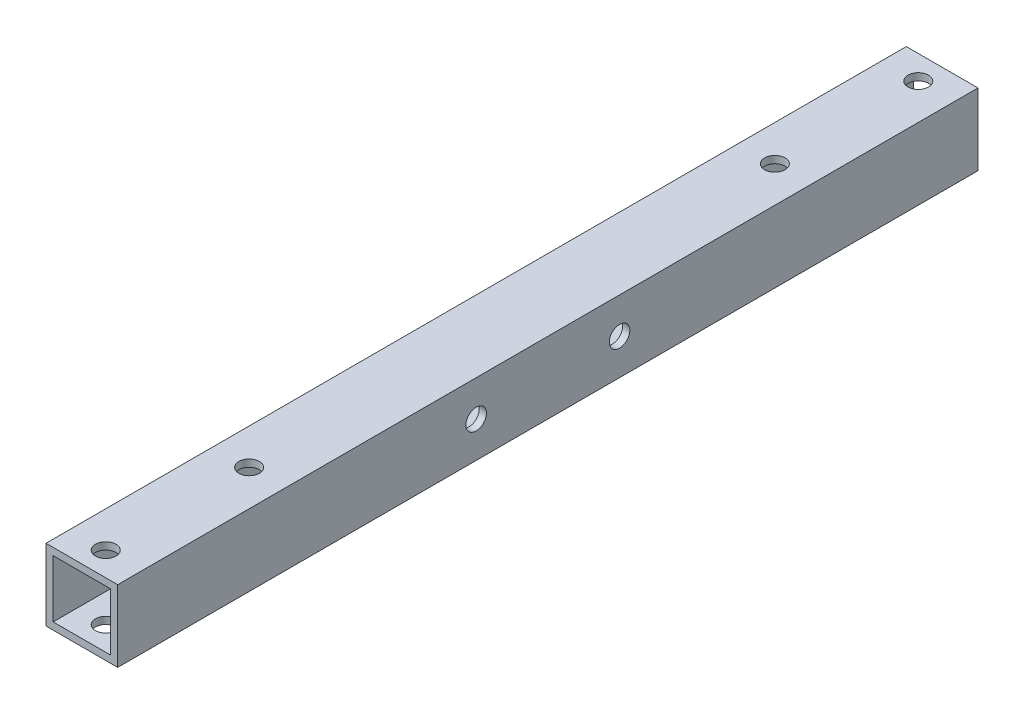
ISO-10303-21;
HEADER;
FILE_DESCRIPTION(('STEP AP214'),'2;1');
FILE_NAME('part.step','',(''),(''),'','','');
FILE_SCHEMA(('AUTOMOTIVE_DESIGN { 1 0 10303 214 1 1 1 1 }'));
ENDSEC;
DATA;
#1=APPLICATION_CONTEXT('core data for automotive mechanical design processes');
#2=APPLICATION_PROTOCOL_DEFINITION('international standard','automotive_design',2000,#1);
#3=PRODUCT_CONTEXT('',#1,'mechanical');
#4=PRODUCT('Part','Part','',(#3));
#5=PRODUCT_RELATED_PRODUCT_CATEGORY('part','',(#4));
#6=PRODUCT_DEFINITION_FORMATION('','',#4);
#7=PRODUCT_DEFINITION_CONTEXT('part definition',#1,'design');
#8=PRODUCT_DEFINITION('design','',#6,#7);
#9=PRODUCT_DEFINITION_SHAPE('','',#8);
#10=(LENGTH_UNIT() NAMED_UNIT(*) SI_UNIT(.MILLI.,.METRE.));
#11=(NAMED_UNIT(*) PLANE_ANGLE_UNIT() SI_UNIT($,.RADIAN.));
#12=(NAMED_UNIT(*) SI_UNIT($,.STERADIAN.) SOLID_ANGLE_UNIT());
#13=UNCERTAINTY_MEASURE_WITH_UNIT(LENGTH_MEASURE(1.E-05),#10,'distance_accuracy_value','');
#14=(GEOMETRIC_REPRESENTATION_CONTEXT(3) GLOBAL_UNCERTAINTY_ASSIGNED_CONTEXT((#13)) GLOBAL_UNIT_ASSIGNED_CONTEXT((#10,
#11,#12)) REPRESENTATION_CONTEXT('',''));
#15=CARTESIAN_POINT('',(0.,0.,0.));
#16=DIRECTION('',(0.,0.,1.));
#17=DIRECTION('',(1.,0.,0.));
#18=AXIS2_PLACEMENT_3D('',#15,#16,#17);
#19=CARTESIAN_POINT('',(-7.5,7.5,180.));
#20=DIRECTION('',(0.,-1.,0.));
#21=DIRECTION('',(0.,0.,-1.));
#22=AXIS2_PLACEMENT_3D('',#19,#20,#21);
#23=PLANE('',#22);
#24=CARTESIAN_POINT('',(0.,7.5,5.));
#25=DIRECTION('',(0.,1.,0.));
#26=DIRECTION('',(0.,0.,1.));
#27=AXIS2_PLACEMENT_3D('',#24,#25,#26);
#28=CIRCLE('',#27,2.15);
#29=CARTESIAN_POINT('',(0.,7.5,7.15));
#30=VERTEX_POINT('',#29);
#31=EDGE_CURVE('E295',#30,#30,#28,.T.);
#32=ORIENTED_EDGE('',*,*,#31,.F.);
#33=EDGE_LOOP('',(#32));
#34=FACE_BOUND('',#33,.T.);
#35=CARTESIAN_POINT('',(0.,7.5,35.));
#36=DIRECTION('',(0.,1.,0.));
#37=DIRECTION('',(0.,0.,1.));
#38=AXIS2_PLACEMENT_3D('',#35,#36,#37);
#39=CIRCLE('',#38,2.15);
#40=CARTESIAN_POINT('',(0.,7.5,37.15));
#41=VERTEX_POINT('',#40);
#42=EDGE_CURVE('E298',#41,#41,#39,.T.);
#43=ORIENTED_EDGE('',*,*,#42,.F.);
#44=EDGE_LOOP('',(#43));
#45=FACE_BOUND('',#44,.T.);
#46=DIRECTION('',(-1.,0.,0.));
#47=VECTOR('',#46,1.);
#48=CARTESIAN_POINT('',(-7.5,7.5,0.));
#49=LINE('',#48,#47);
#50=CARTESIAN_POINT('',(7.5,7.5,0.));
#51=VERTEX_POINT('',#50);
#52=CARTESIAN_POINT('',(-7.5,7.5,0.));
#53=VERTEX_POINT('',#52);
#54=EDGE_CURVE('E178',#51,#53,#49,.T.);
#55=ORIENTED_EDGE('',*,*,#54,.T.);
#56=DIRECTION('',(0.,0.,-1.));
#57=VECTOR('',#56,1.);
#58=CARTESIAN_POINT('',(-7.5,7.5,180.));
#59=LINE('',#58,#57);
#60=CARTESIAN_POINT('',(-7.5,7.5,180.));
#61=VERTEX_POINT('',#60);
#62=EDGE_CURVE('E67',#61,#53,#59,.T.);
#63=ORIENTED_EDGE('',*,*,#62,.F.);
#64=DIRECTION('',(-1.,0.,0.));
#65=VECTOR('',#64,1.);
#66=CARTESIAN_POINT('',(-7.5,7.5,180.));
#67=LINE('',#66,#65);
#68=CARTESIAN_POINT('',(7.5,7.5,180.));
#69=VERTEX_POINT('',#68);
#70=EDGE_CURVE('E168',#69,#61,#67,.T.);
#71=ORIENTED_EDGE('',*,*,#70,.F.);
#72=DIRECTION('',(0.,0.,-1.));
#73=VECTOR('',#72,1.);
#74=CARTESIAN_POINT('',(7.5,7.5,180.));
#75=LINE('',#74,#73);
#76=EDGE_CURVE('E12',#69,#51,#75,.T.);
#77=ORIENTED_EDGE('',*,*,#76,.T.);
#78=EDGE_LOOP('',(#55,#63,#71,#77));
#79=FACE_BOUND('',#78,.T.);
#80=CARTESIAN_POINT('',(0.,7.5,175.));
#81=DIRECTION('',(0.,1.,0.));
#82=DIRECTION('',(0.,0.,1.));
#83=AXIS2_PLACEMENT_3D('',#80,#81,#82);
#84=CIRCLE('',#83,2.15000000000001);
#85=CARTESIAN_POINT('',(0.,7.5,177.15));
#86=VERTEX_POINT('',#85);
#87=EDGE_CURVE('E306',#86,#86,#84,.F.);
#88=ORIENTED_EDGE('',*,*,#87,.T.);
#89=EDGE_LOOP('',(#88));
#90=FACE_BOUND('',#89,.T.);
#91=CARTESIAN_POINT('',(0.,7.5,145.));
#92=DIRECTION('',(0.,1.,0.));
#93=DIRECTION('',(0.,0.,1.));
#94=AXIS2_PLACEMENT_3D('',#91,#92,#93);
#95=CIRCLE('',#94,2.14999999999998);
#96=CARTESIAN_POINT('',(0.,7.5,147.15));
#97=VERTEX_POINT('',#96);
#98=EDGE_CURVE('E313',#97,#97,#95,.F.);
#99=ORIENTED_EDGE('',*,*,#98,.T.);
#100=EDGE_LOOP('',(#99));
#101=FACE_BOUND('',#100,.T.);
#102=ADVANCED_FACE('F58',(#34,#45,#79,#90,#101),#23,.F.);
#103=CARTESIAN_POINT('',(-7.5,-7.5,180.));
#104=DIRECTION('',(0.,1.,0.));
#105=DIRECTION('',(0.,0.,1.));
#106=AXIS2_PLACEMENT_3D('',#103,#104,#105);
#107=PLANE('',#106);
#108=CARTESIAN_POINT('',(0.,-7.5,5.));
#109=DIRECTION('',(0.,1.,0.));
#110=DIRECTION('',(0.,0.,1.));
#111=AXIS2_PLACEMENT_3D('',#108,#109,#110);
#112=CIRCLE('',#111,2.15);
#113=CARTESIAN_POINT('',(0.,-7.5,7.15));
#114=VERTEX_POINT('',#113);
#115=EDGE_CURVE('E202',#114,#114,#112,.T.);
#116=ORIENTED_EDGE('',*,*,#115,.T.);
#117=EDGE_LOOP('',(#116));
#118=FACE_BOUND('',#117,.T.);
#119=CARTESIAN_POINT('',(0.,-7.5,35.));
#120=DIRECTION('',(0.,1.,0.));
#121=DIRECTION('',(0.,0.,1.));
#122=AXIS2_PLACEMENT_3D('',#119,#120,#121);
#123=CIRCLE('',#122,2.15);
#124=CARTESIAN_POINT('',(0.,-7.5,37.15));
#125=VERTEX_POINT('',#124);
#126=EDGE_CURVE('E300',#125,#125,#123,.T.);
#127=ORIENTED_EDGE('',*,*,#126,.T.);
#128=EDGE_LOOP('',(#127));
#129=FACE_BOUND('',#128,.T.);
#130=DIRECTION('',(1.,0.,0.));
#131=VECTOR('',#130,1.);
#132=CARTESIAN_POINT('',(-7.5,-7.5,0.));
#133=LINE('',#132,#131);
#134=CARTESIAN_POINT('',(-7.5,-7.5,0.));
#135=VERTEX_POINT('',#134);
#136=CARTESIAN_POINT('',(7.5,-7.5,0.));
#137=VERTEX_POINT('',#136);
#138=EDGE_CURVE('E169',#135,#137,#133,.T.);
#139=ORIENTED_EDGE('',*,*,#138,.T.);
#140=DIRECTION('',(0.,0.,-1.));
#141=VECTOR('',#140,1.);
#142=CARTESIAN_POINT('',(7.5,-7.5,180.));
#143=LINE('',#142,#141);
#144=CARTESIAN_POINT('',(7.5,-7.5,180.));
#145=VERTEX_POINT('',#144);
#146=EDGE_CURVE('E175',#145,#137,#143,.T.);
#147=ORIENTED_EDGE('',*,*,#146,.F.);
#148=DIRECTION('',(1.,0.,0.));
#149=VECTOR('',#148,1.);
#150=CARTESIAN_POINT('',(-7.5,-7.5,180.));
#151=LINE('',#150,#149);
#152=CARTESIAN_POINT('',(-7.5,-7.5,180.));
#153=VERTEX_POINT('',#152);
#154=EDGE_CURVE('E173',#153,#145,#151,.T.);
#155=ORIENTED_EDGE('',*,*,#154,.F.);
#156=DIRECTION('',(0.,0.,-1.));
#157=VECTOR('',#156,1.);
#158=CARTESIAN_POINT('',(-7.5,-7.5,180.));
#159=LINE('',#158,#157);
#160=EDGE_CURVE('E185',#153,#135,#159,.T.);
#161=ORIENTED_EDGE('',*,*,#160,.T.);
#162=EDGE_LOOP('',(#139,#147,#155,#161));
#163=FACE_BOUND('',#162,.T.);
#164=CARTESIAN_POINT('',(0.,-7.5,175.));
#165=DIRECTION('',(0.,1.,0.));
#166=DIRECTION('',(0.,0.,1.));
#167=AXIS2_PLACEMENT_3D('',#164,#165,#166);
#168=CIRCLE('',#167,2.15000000000001);
#169=CARTESIAN_POINT('',(0.,-7.5,177.15));
#170=VERTEX_POINT('',#169);
#171=EDGE_CURVE('E301',#170,#170,#168,.F.);
#172=ORIENTED_EDGE('',*,*,#171,.F.);
#173=EDGE_LOOP('',(#172));
#174=FACE_BOUND('',#173,.T.);
#175=CARTESIAN_POINT('',(0.,-7.5,145.));
#176=DIRECTION('',(0.,1.,0.));
#177=DIRECTION('',(0.,0.,1.));
#178=AXIS2_PLACEMENT_3D('',#175,#176,#177);
#179=CIRCLE('',#178,2.14999999999998);
#180=CARTESIAN_POINT('',(0.,-7.5,147.15));
#181=VERTEX_POINT('',#180);
#182=EDGE_CURVE('E310',#181,#181,#179,.F.);
#183=ORIENTED_EDGE('',*,*,#182,.F.);
#184=EDGE_LOOP('',(#183));
#185=FACE_BOUND('',#184,.T.);
#186=ADVANCED_FACE('F276',(#118,#129,#163,#174,#185),#107,.F.);
#187=CARTESIAN_POINT('',(-7.5,6.,180.));
#188=DIRECTION('',(0.,-1.,0.));
#189=DIRECTION('',(0.,0.,-1.));
#190=AXIS2_PLACEMENT_3D('',#187,#188,#189);
#191=PLANE('',#190);
#192=CARTESIAN_POINT('',(0.,6.,5.));
#193=DIRECTION('',(0.,-1.,0.));
#194=DIRECTION('',(0.,0.,-1.));
#195=AXIS2_PLACEMENT_3D('',#192,#193,#194);
#196=CIRCLE('',#195,2.15);
#197=CARTESIAN_POINT('',(0.,6.,2.85));
#198=VERTEX_POINT('',#197);
#199=EDGE_CURVE('E220',#198,#198,#196,.T.);
#200=ORIENTED_EDGE('',*,*,#199,.F.);
#201=EDGE_LOOP('',(#200));
#202=FACE_BOUND('',#201,.T.);
#203=CARTESIAN_POINT('',(0.,6.,175.));
#204=DIRECTION('',(0.,-1.,0.));
#205=DIRECTION('',(0.,0.,-1.));
#206=AXIS2_PLACEMENT_3D('',#203,#204,#205);
#207=CIRCLE('',#206,2.15000000000001);
#208=CARTESIAN_POINT('',(0.,6.,172.85));
#209=VERTEX_POINT('',#208);
#210=EDGE_CURVE('E205',#209,#209,#207,.F.);
#211=ORIENTED_EDGE('',*,*,#210,.T.);
#212=EDGE_LOOP('',(#211));
#213=FACE_BOUND('',#212,.T.);
#214=CARTESIAN_POINT('',(0.,6.,35.));
#215=DIRECTION('',(0.,-1.,0.));
#216=DIRECTION('',(0.,0.,-1.));
#217=AXIS2_PLACEMENT_3D('',#214,#215,#216);
#218=CIRCLE('',#217,2.15);
#219=CARTESIAN_POINT('',(0.,6.,32.85));
#220=VERTEX_POINT('',#219);
#221=EDGE_CURVE('E201',#220,#220,#218,.T.);
#222=ORIENTED_EDGE('',*,*,#221,.F.);
#223=EDGE_LOOP('',(#222));
#224=FACE_BOUND('',#223,.T.);
#225=DIRECTION('',(-1.,0.,0.));
#226=VECTOR('',#225,1.);
#227=CARTESIAN_POINT('',(-7.5,6.,0.));
#228=LINE('',#227,#226);
#229=CARTESIAN_POINT('',(6.,6.,0.));
#230=VERTEX_POINT('',#229);
#231=CARTESIAN_POINT('',(-6.,6.,0.));
#232=VERTEX_POINT('',#231);
#233=EDGE_CURVE('E141',#230,#232,#228,.T.);
#234=ORIENTED_EDGE('',*,*,#233,.F.);
#235=DIRECTION('',(0.,0.,-1.));
#236=VECTOR('',#235,1.);
#237=CARTESIAN_POINT('',(6.,6.,180.));
#238=LINE('',#237,#236);
#239=CARTESIAN_POINT('',(6.,6.,180.));
#240=VERTEX_POINT('',#239);
#241=EDGE_CURVE('E128',#240,#230,#238,.T.);
#242=ORIENTED_EDGE('',*,*,#241,.F.);
#243=DIRECTION('',(-1.,0.,0.));
#244=VECTOR('',#243,1.);
#245=CARTESIAN_POINT('',(-7.5,6.,180.));
#246=LINE('',#245,#244);
#247=CARTESIAN_POINT('',(-6.,6.,180.));
#248=VERTEX_POINT('',#247);
#249=EDGE_CURVE('E133',#240,#248,#246,.T.);
#250=ORIENTED_EDGE('',*,*,#249,.T.);
#251=DIRECTION('',(0.,0.,-1.));
#252=VECTOR('',#251,1.);
#253=CARTESIAN_POINT('',(-6.,6.,180.));
#254=LINE('',#253,#252);
#255=EDGE_CURVE('E143',#248,#232,#254,.T.);
#256=ORIENTED_EDGE('',*,*,#255,.T.);
#257=EDGE_LOOP('',(#234,#242,#250,#256));
#258=FACE_BOUND('',#257,.T.);
#259=CARTESIAN_POINT('',(0.,6.,145.));
#260=DIRECTION('',(0.,-1.,0.));
#261=DIRECTION('',(0.,0.,-1.));
#262=AXIS2_PLACEMENT_3D('',#259,#260,#261);
#263=CIRCLE('',#262,2.14999999999998);
#264=CARTESIAN_POINT('',(0.,6.,142.85));
#265=VERTEX_POINT('',#264);
#266=EDGE_CURVE('E208',#265,#265,#263,.F.);
#267=ORIENTED_EDGE('',*,*,#266,.T.);
#268=EDGE_LOOP('',(#267));
#269=FACE_BOUND('',#268,.T.);
#270=ADVANCED_FACE('F137',(#202,#213,#224,#258,#269),#191,.T.);
#271=CARTESIAN_POINT('',(-7.5,-6.,180.));
#272=DIRECTION('',(0.,1.,0.));
#273=DIRECTION('',(0.,0.,1.));
#274=AXIS2_PLACEMENT_3D('',#271,#272,#273);
#275=PLANE('',#274);
#276=CARTESIAN_POINT('',(0.,-6.,5.));
#277=DIRECTION('',(0.,1.,0.));
#278=DIRECTION('',(0.,0.,1.));
#279=AXIS2_PLACEMENT_3D('',#276,#277,#278);
#280=CIRCLE('',#279,2.15);
#281=CARTESIAN_POINT('',(0.,-6.,7.15));
#282=VERTEX_POINT('',#281);
#283=EDGE_CURVE('E62',#282,#282,#280,.T.);
#284=ORIENTED_EDGE('',*,*,#283,.F.);
#285=EDGE_LOOP('',(#284));
#286=FACE_BOUND('',#285,.T.);
#287=CARTESIAN_POINT('',(0.,-6.,175.));
#288=DIRECTION('',(0.,1.,0.));
#289=DIRECTION('',(0.,0.,1.));
#290=AXIS2_PLACEMENT_3D('',#287,#288,#289);
#291=CIRCLE('',#290,2.15000000000001);
#292=CARTESIAN_POINT('',(0.,-6.,177.15));
#293=VERTEX_POINT('',#292);
#294=EDGE_CURVE('E203',#293,#293,#291,.F.);
#295=ORIENTED_EDGE('',*,*,#294,.T.);
#296=EDGE_LOOP('',(#295));
#297=FACE_BOUND('',#296,.T.);
#298=CARTESIAN_POINT('',(0.,-6.,35.));
#299=DIRECTION('',(0.,1.,0.));
#300=DIRECTION('',(0.,0.,1.));
#301=AXIS2_PLACEMENT_3D('',#298,#299,#300);
#302=CIRCLE('',#301,2.15);
#303=CARTESIAN_POINT('',(0.,-6.,37.15));
#304=VERTEX_POINT('',#303);
#305=EDGE_CURVE('E198',#304,#304,#302,.T.);
#306=ORIENTED_EDGE('',*,*,#305,.F.);
#307=EDGE_LOOP('',(#306));
#308=FACE_BOUND('',#307,.T.);
#309=DIRECTION('',(1.,0.,0.));
#310=VECTOR('',#309,1.);
#311=CARTESIAN_POINT('',(-7.5,-6.,0.));
#312=LINE('',#311,#310);
#313=CARTESIAN_POINT('',(-5.99999999999999,-6.,0.));
#314=VERTEX_POINT('',#313);
#315=CARTESIAN_POINT('',(6.,-6.,0.));
#316=VERTEX_POINT('',#315);
#317=EDGE_CURVE('E134',#314,#316,#312,.T.);
#318=ORIENTED_EDGE('',*,*,#317,.F.);
#319=DIRECTION('',(0.,0.,-1.));
#320=VECTOR('',#319,1.);
#321=CARTESIAN_POINT('',(-5.99999999999999,-6.,180.));
#322=LINE('',#321,#320);
#323=CARTESIAN_POINT('',(-5.99999999999999,-6.,180.));
#324=VERTEX_POINT('',#323);
#325=EDGE_CURVE('E75',#324,#314,#322,.T.);
#326=ORIENTED_EDGE('',*,*,#325,.F.);
#327=DIRECTION('',(1.,0.,0.));
#328=VECTOR('',#327,1.);
#329=CARTESIAN_POINT('',(-7.5,-6.,180.));
#330=LINE('',#329,#328);
#331=CARTESIAN_POINT('',(6.,-6.,180.));
#332=VERTEX_POINT('',#331);
#333=EDGE_CURVE('E149',#324,#332,#330,.T.);
#334=ORIENTED_EDGE('',*,*,#333,.T.);
#335=DIRECTION('',(0.,0.,-1.));
#336=VECTOR('',#335,1.);
#337=CARTESIAN_POINT('',(6.,-6.,180.));
#338=LINE('',#337,#336);
#339=EDGE_CURVE('E129',#332,#316,#338,.T.);
#340=ORIENTED_EDGE('',*,*,#339,.T.);
#341=EDGE_LOOP('',(#318,#326,#334,#340));
#342=FACE_BOUND('',#341,.T.);
#343=CARTESIAN_POINT('',(0.,-6.,145.));
#344=DIRECTION('',(0.,1.,0.));
#345=DIRECTION('',(0.,0.,1.));
#346=AXIS2_PLACEMENT_3D('',#343,#344,#345);
#347=CIRCLE('',#346,2.14999999999998);
#348=CARTESIAN_POINT('',(0.,-6.,147.15));
#349=VERTEX_POINT('',#348);
#350=EDGE_CURVE('E206',#349,#349,#347,.F.);
#351=ORIENTED_EDGE('',*,*,#350,.T.);
#352=EDGE_LOOP('',(#351));
#353=FACE_BOUND('',#352,.T.);
#354=ADVANCED_FACE('F354',(#286,#297,#308,#342,#353),#275,.T.);
#355=CARTESIAN_POINT('',(0.,0.,180.));
#356=DIRECTION('',(0.,0.,1.));
#357=DIRECTION('',(1.,0.,0.));
#358=AXIS2_PLACEMENT_3D('',#355,#356,#357);
#359=PLANE('',#358);
#360=DIRECTION('',(0.,1.,0.));
#361=VECTOR('',#360,1.);
#362=CARTESIAN_POINT('',(7.5,7.5,180.));
#363=LINE('',#362,#361);
#364=EDGE_CURVE('E165',#145,#69,#363,.T.);
#365=ORIENTED_EDGE('',*,*,#364,.T.);
#366=ORIENTED_EDGE('',*,*,#70,.T.);
#367=DIRECTION('',(0.,-1.,0.));
#368=VECTOR('',#367,1.);
#369=CARTESIAN_POINT('',(-7.5,7.5,180.));
#370=LINE('',#369,#368);
#371=EDGE_CURVE('E171',#61,#153,#370,.T.);
#372=ORIENTED_EDGE('',*,*,#371,.T.);
#373=ORIENTED_EDGE('',*,*,#154,.T.);
#374=EDGE_LOOP('',(#365,#366,#372,#373));
#375=FACE_BOUND('',#374,.T.);
#376=ORIENTED_EDGE('',*,*,#249,.F.);
#377=DIRECTION('',(0.,1.,0.));
#378=VECTOR('',#377,1.);
#379=CARTESIAN_POINT('',(6.,7.5,180.));
#380=LINE('',#379,#378);
#381=EDGE_CURVE('E125',#332,#240,#380,.T.);
#382=ORIENTED_EDGE('',*,*,#381,.F.);
#383=ORIENTED_EDGE('',*,*,#333,.F.);
#384=DIRECTION('',(0.,-1.,0.));
#385=VECTOR('',#384,1.);
#386=CARTESIAN_POINT('',(-6.,7.5,180.));
#387=LINE('',#386,#385);
#388=EDGE_CURVE('E147',#248,#324,#387,.T.);
#389=ORIENTED_EDGE('',*,*,#388,.F.);
#390=EDGE_LOOP('',(#376,#382,#383,#389));
#391=FACE_BOUND('',#390,.T.);
#392=ADVANCED_FACE('F146',(#375,#391),#359,.T.);
#393=CARTESIAN_POINT('',(0.,0.,0.));
#394=DIRECTION('',(0.,0.,1.));
#395=DIRECTION('',(1.,0.,0.));
#396=AXIS2_PLACEMENT_3D('',#393,#394,#395);
#397=PLANE('',#396);
#398=DIRECTION('',(0.,1.,0.));
#399=VECTOR('',#398,1.);
#400=CARTESIAN_POINT('',(7.5,7.5,0.));
#401=LINE('',#400,#399);
#402=EDGE_CURVE('E142',#137,#51,#401,.T.);
#403=ORIENTED_EDGE('',*,*,#402,.F.);
#404=ORIENTED_EDGE('',*,*,#138,.F.);
#405=DIRECTION('',(0.,-1.,0.));
#406=VECTOR('',#405,1.);
#407=CARTESIAN_POINT('',(-7.5,7.5,0.));
#408=LINE('',#407,#406);
#409=EDGE_CURVE('E180',#53,#135,#408,.T.);
#410=ORIENTED_EDGE('',*,*,#409,.F.);
#411=ORIENTED_EDGE('',*,*,#54,.F.);
#412=EDGE_LOOP('',(#403,#404,#410,#411));
#413=FACE_BOUND('',#412,.T.);
#414=DIRECTION('',(0.,1.,0.));
#415=VECTOR('',#414,1.);
#416=CARTESIAN_POINT('',(6.,7.5,0.));
#417=LINE('',#416,#415);
#418=EDGE_CURVE('E83',#316,#230,#417,.T.);
#419=ORIENTED_EDGE('',*,*,#418,.T.);
#420=ORIENTED_EDGE('',*,*,#233,.T.);
#421=DIRECTION('',(0.,-1.,0.));
#422=VECTOR('',#421,1.);
#423=CARTESIAN_POINT('',(-6.,7.5,0.));
#424=LINE('',#423,#422);
#425=EDGE_CURVE('E157',#232,#314,#424,.T.);
#426=ORIENTED_EDGE('',*,*,#425,.T.);
#427=ORIENTED_EDGE('',*,*,#317,.T.);
#428=EDGE_LOOP('',(#419,#420,#426,#427));
#429=FACE_BOUND('',#428,.T.);
#430=ADVANCED_FACE('F258',(#413,#429),#397,.F.);
#431=CARTESIAN_POINT('',(7.5,7.5,180.));
#432=DIRECTION('',(-1.,0.,0.));
#433=DIRECTION('',(0.,-1.,0.));
#434=AXIS2_PLACEMENT_3D('',#431,#432,#433);
#435=PLANE('',#434);
#436=CARTESIAN_POINT('',(7.5,0.,75.));
#437=DIRECTION('',(1.,0.,0.));
#438=DIRECTION('',(0.,0.,-1.));
#439=AXIS2_PLACEMENT_3D('',#436,#437,#438);
#440=CIRCLE('',#439,2.15);
#441=CARTESIAN_POINT('',(7.5,0.,72.85));
#442=VERTEX_POINT('',#441);
#443=EDGE_CURVE('E226',#442,#442,#440,.T.);
#444=ORIENTED_EDGE('',*,*,#443,.F.);
#445=EDGE_LOOP('',(#444));
#446=FACE_BOUND('',#445,.T.);
#447=CARTESIAN_POINT('',(7.5,0.,105.));
#448=DIRECTION('',(1.,0.,0.));
#449=DIRECTION('',(0.,0.,1.));
#450=AXIS2_PLACEMENT_3D('',#447,#448,#449);
#451=CIRCLE('',#450,2.15000000000002);
#452=CARTESIAN_POINT('',(7.5,0.,102.85));
#453=VERTEX_POINT('',#452);
#454=EDGE_CURVE('E223',#453,#453,#451,.T.);
#455=ORIENTED_EDGE('',*,*,#454,.F.);
#456=EDGE_LOOP('',(#455));
#457=FACE_BOUND('',#456,.T.);
#458=ORIENTED_EDGE('',*,*,#402,.T.);
#459=ORIENTED_EDGE('',*,*,#76,.F.);
#460=ORIENTED_EDGE('',*,*,#364,.F.);
#461=ORIENTED_EDGE('',*,*,#146,.T.);
#462=EDGE_LOOP('',(#458,#459,#460,#461));
#463=FACE_BOUND('',#462,.T.);
#464=ADVANCED_FACE('F60',(#446,#457,#463),#435,.F.);
#465=CARTESIAN_POINT('',(-7.5,7.5,180.));
#466=DIRECTION('',(1.,0.,0.));
#467=DIRECTION('',(0.,1.,0.));
#468=AXIS2_PLACEMENT_3D('',#465,#466,#467);
#469=PLANE('',#468);
#470=CARTESIAN_POINT('',(-7.5,0.,75.));
#471=DIRECTION('',(1.,0.,0.));
#472=DIRECTION('',(0.,0.,-1.));
#473=AXIS2_PLACEMENT_3D('',#470,#471,#472);
#474=CIRCLE('',#473,2.15);
#475=CARTESIAN_POINT('',(-7.5,0.,72.85));
#476=VERTEX_POINT('',#475);
#477=EDGE_CURVE('E194',#476,#476,#474,.T.);
#478=ORIENTED_EDGE('',*,*,#477,.T.);
#479=EDGE_LOOP('',(#478));
#480=FACE_BOUND('',#479,.T.);
#481=CARTESIAN_POINT('',(-7.5,0.,105.));
#482=DIRECTION('',(1.,0.,0.));
#483=DIRECTION('',(0.,0.,1.));
#484=AXIS2_PLACEMENT_3D('',#481,#482,#483);
#485=CIRCLE('',#484,2.15000000000002);
#486=CARTESIAN_POINT('',(-7.5,0.,102.85));
#487=VERTEX_POINT('',#486);
#488=EDGE_CURVE('E229',#487,#487,#485,.T.);
#489=ORIENTED_EDGE('',*,*,#488,.T.);
#490=EDGE_LOOP('',(#489));
#491=FACE_BOUND('',#490,.T.);
#492=ORIENTED_EDGE('',*,*,#409,.T.);
#493=ORIENTED_EDGE('',*,*,#160,.F.);
#494=ORIENTED_EDGE('',*,*,#371,.F.);
#495=ORIENTED_EDGE('',*,*,#62,.T.);
#496=EDGE_LOOP('',(#492,#493,#494,#495));
#497=FACE_BOUND('',#496,.T.);
#498=ADVANCED_FACE('F244',(#480,#491,#497),#469,.F.);
#499=CARTESIAN_POINT('',(6.,7.5,180.));
#500=DIRECTION('',(-1.,0.,0.));
#501=DIRECTION('',(0.,-1.,0.));
#502=AXIS2_PLACEMENT_3D('',#499,#500,#501);
#503=PLANE('',#502);
#504=CARTESIAN_POINT('',(6.,0.,75.));
#505=DIRECTION('',(-1.,0.,0.));
#506=DIRECTION('',(0.,-1.,0.));
#507=AXIS2_PLACEMENT_3D('',#504,#505,#506);
#508=CIRCLE('',#507,2.15);
#509=CARTESIAN_POINT('',(6.,0.,72.85));
#510=VERTEX_POINT('',#509);
#511=EDGE_CURVE('E155',#510,#510,#508,.T.);
#512=ORIENTED_EDGE('',*,*,#511,.F.);
#513=EDGE_LOOP('',(#512));
#514=FACE_BOUND('',#513,.T.);
#515=CARTESIAN_POINT('',(6.,0.,105.));
#516=DIRECTION('',(-1.,0.,0.));
#517=DIRECTION('',(0.,-1.,0.));
#518=AXIS2_PLACEMENT_3D('',#515,#516,#517);
#519=CIRCLE('',#518,2.15000000000002);
#520=CARTESIAN_POINT('',(6.,0.,102.85));
#521=VERTEX_POINT('',#520);
#522=EDGE_CURVE('E193',#521,#521,#519,.T.);
#523=ORIENTED_EDGE('',*,*,#522,.F.);
#524=EDGE_LOOP('',(#523));
#525=FACE_BOUND('',#524,.T.);
#526=ORIENTED_EDGE('',*,*,#418,.F.);
#527=ORIENTED_EDGE('',*,*,#339,.F.);
#528=ORIENTED_EDGE('',*,*,#381,.T.);
#529=ORIENTED_EDGE('',*,*,#241,.T.);
#530=EDGE_LOOP('',(#526,#527,#528,#529));
#531=FACE_BOUND('',#530,.T.);
#532=ADVANCED_FACE('F127',(#514,#525,#531),#503,.T.);
#533=CARTESIAN_POINT('',(-6.,7.5,180.));
#534=DIRECTION('',(1.,0.,0.));
#535=DIRECTION('',(0.,1.,0.));
#536=AXIS2_PLACEMENT_3D('',#533,#534,#535);
#537=PLANE('',#536);
#538=CARTESIAN_POINT('',(-6.,0.,75.));
#539=DIRECTION('',(1.,0.,0.));
#540=DIRECTION('',(0.,1.,0.));
#541=AXIS2_PLACEMENT_3D('',#538,#539,#540);
#542=CIRCLE('',#541,2.15);
#543=CARTESIAN_POINT('',(-6.,0.,72.85));
#544=VERTEX_POINT('',#543);
#545=EDGE_CURVE('E195',#544,#544,#542,.T.);
#546=ORIENTED_EDGE('',*,*,#545,.F.);
#547=EDGE_LOOP('',(#546));
#548=FACE_BOUND('',#547,.T.);
#549=CARTESIAN_POINT('',(-6.,0.,105.));
#550=DIRECTION('',(1.,0.,0.));
#551=DIRECTION('',(0.,1.,0.));
#552=AXIS2_PLACEMENT_3D('',#549,#550,#551);
#553=CIRCLE('',#552,2.15000000000002);
#554=CARTESIAN_POINT('',(-6.,0.,102.85));
#555=VERTEX_POINT('',#554);
#556=EDGE_CURVE('E190',#555,#555,#553,.T.);
#557=ORIENTED_EDGE('',*,*,#556,.F.);
#558=EDGE_LOOP('',(#557));
#559=FACE_BOUND('',#558,.T.);
#560=ORIENTED_EDGE('',*,*,#425,.F.);
#561=ORIENTED_EDGE('',*,*,#255,.F.);
#562=ORIENTED_EDGE('',*,*,#388,.T.);
#563=ORIENTED_EDGE('',*,*,#325,.T.);
#564=EDGE_LOOP('',(#560,#561,#562,#563));
#565=FACE_BOUND('',#564,.T.);
#566=ADVANCED_FACE('F243',(#548,#559,#565),#537,.T.);
#567=CARTESIAN_POINT('',(-7.5,0.,105.));
#568=DIRECTION('',(1.,0.,0.));
#569=DIRECTION('',(0.,0.,-1.));
#570=AXIS2_PLACEMENT_3D('',#567,#568,#569);
#571=CYLINDRICAL_SURFACE('',#570,2.15000000000002);
#572=CARTESIAN_POINT('',(-6.,0.,102.85));
#573=CARTESIAN_POINT('',(-6.015625,0.,102.85));
#574=CARTESIAN_POINT('',(-6.03125,0.,102.85));
#575=CARTESIAN_POINT('',(-6.0625,0.,102.85));
#576=CARTESIAN_POINT('',(-6.078125,0.,102.85));
#577=CARTESIAN_POINT('',(-6.109375,0.,102.85));
#578=CARTESIAN_POINT('',(-6.125,0.,102.85));
#579=CARTESIAN_POINT('',(-6.15625,0.,102.85));
#580=CARTESIAN_POINT('',(-6.171875,0.,102.85));
#581=CARTESIAN_POINT('',(-6.203125,0.,102.85));
#582=CARTESIAN_POINT('',(-6.21875,0.,102.85));
#583=CARTESIAN_POINT('',(-6.25,0.,102.85));
#584=CARTESIAN_POINT('',(-6.265625,0.,102.85));
#585=CARTESIAN_POINT('',(-6.296875,0.,102.85));
#586=CARTESIAN_POINT('',(-6.3125,0.,102.85));
#587=CARTESIAN_POINT('',(-6.34375,0.,102.85));
#588=CARTESIAN_POINT('',(-6.359375,0.,102.85));
#589=CARTESIAN_POINT('',(-6.390625,0.,102.85));
#590=CARTESIAN_POINT('',(-6.40625,0.,102.85));
#591=CARTESIAN_POINT('',(-6.4375,0.,102.85));
#592=CARTESIAN_POINT('',(-6.453125,0.,102.85));
#593=CARTESIAN_POINT('',(-6.484375,0.,102.85));
#594=CARTESIAN_POINT('',(-6.5,0.,102.85));
#595=CARTESIAN_POINT('',(-6.53125,0.,102.85));
#596=CARTESIAN_POINT('',(-6.546875,0.,102.85));
#597=CARTESIAN_POINT('',(-6.578125,0.,102.85));
#598=CARTESIAN_POINT('',(-6.59375,0.,102.85));
#599=CARTESIAN_POINT('',(-6.625,0.,102.85));
#600=CARTESIAN_POINT('',(-6.640625,0.,102.85));
#601=CARTESIAN_POINT('',(-6.671875,0.,102.85));
#602=CARTESIAN_POINT('',(-6.6875,0.,102.85));
#603=CARTESIAN_POINT('',(-6.71875,0.,102.85));
#604=CARTESIAN_POINT('',(-6.734375,0.,102.85));
#605=CARTESIAN_POINT('',(-6.765625,0.,102.85));
#606=CARTESIAN_POINT('',(-6.78125,0.,102.85));
#607=CARTESIAN_POINT('',(-6.8125,0.,102.85));
#608=CARTESIAN_POINT('',(-6.828125,0.,102.85));
#609=CARTESIAN_POINT('',(-6.859375,0.,102.85));
#610=CARTESIAN_POINT('',(-6.875,0.,102.85));
#611=CARTESIAN_POINT('',(-6.90625,0.,102.85));
#612=CARTESIAN_POINT('',(-6.921875,0.,102.85));
#613=CARTESIAN_POINT('',(-6.953125,0.,102.85));
#614=CARTESIAN_POINT('',(-6.96875,0.,102.85));
#615=CARTESIAN_POINT('',(-7.,0.,102.85));
#616=CARTESIAN_POINT('',(-7.015625,0.,102.85));
#617=CARTESIAN_POINT('',(-7.046875,0.,102.85));
#618=CARTESIAN_POINT('',(-7.0625,0.,102.85));
#619=CARTESIAN_POINT('',(-7.09375,0.,102.85));
#620=CARTESIAN_POINT('',(-7.109375,0.,102.85));
#621=CARTESIAN_POINT('',(-7.140625,0.,102.85));
#622=CARTESIAN_POINT('',(-7.15625,0.,102.85));
#623=CARTESIAN_POINT('',(-7.1875,0.,102.85));
#624=CARTESIAN_POINT('',(-7.203125,0.,102.85));
#625=CARTESIAN_POINT('',(-7.234375,0.,102.85));
#626=CARTESIAN_POINT('',(-7.25,0.,102.85));
#627=CARTESIAN_POINT('',(-7.28125,0.,102.85));
#628=CARTESIAN_POINT('',(-7.296875,0.,102.85));
#629=CARTESIAN_POINT('',(-7.328125,0.,102.85));
#630=CARTESIAN_POINT('',(-7.34375,0.,102.85));
#631=CARTESIAN_POINT('',(-7.375,0.,102.85));
#632=CARTESIAN_POINT('',(-7.390625,0.,102.85));
#633=CARTESIAN_POINT('',(-7.421875,0.,102.85));
#634=CARTESIAN_POINT('',(-7.4375,0.,102.85));
#635=CARTESIAN_POINT('',(-7.46875,0.,102.85));
#636=CARTESIAN_POINT('',(-7.484375,0.,102.85));
#637=CARTESIAN_POINT('',(-7.5,0.,102.85));
#638=B_SPLINE_CURVE_WITH_KNOTS('',3,(#572,#573,#574,#575,#576,#577,#578,#579,#580,#581,#582,
#583,#584,#585,#586,#587,#588,#589,#590,#591,#592,#593,#594,#595,#596,#597,#598,#599,#600,#601,
#602,#603,#604,#605,#606,#607,#608,#609,#610,#611,#612,#613,#614,#615,#616,#617,#618,#619,#620,
#621,#622,#623,#624,#625,#626,#627,#628,#629,#630,#631,#632,#633,#634,#635,#636,#637),
.UNSPECIFIED.,.F.,.F.,(4,2,2,2,2,2,2,2,2,2,2,2,2,2,2,2,2,2,2,2,2,2,2,2,2,2,2,2,2,2,2,2,4),(0.,
0.046875,0.0937500000000001,0.140625,0.1875,0.234375,0.28125,0.328125,0.375,0.421875,0.46875,
0.515625,0.5625,0.609375000000001,0.656250000000001,0.703125000000001,0.750000000000001,
0.796875000000001,0.843750000000001,0.890625000000001,0.937500000000001,0.984375000000001,
1.03125,1.078125,1.125,1.171875,1.21875,1.265625,1.3125,1.359375,1.40625,1.453125,1.5),.UNSPECIFIED.);
#639=EDGE_CURVE('BSEAM253',#555,#487,#638,.T.);
#640=ORIENTED_EDGE('',*,*,#556,.T.);
#641=ORIENTED_EDGE('',*,*,#488,.F.);
#642=ORIENTED_EDGE('',*,*,#639,.T.);
#643=ORIENTED_EDGE('',*,*,#639,.F.);
#644=EDGE_LOOP('',(#640,#642,#641,#643));
#645=FACE_BOUND('',#644,.T.);
#646=ADVANCED_FACE('F253',(#645),#571,.F.);
#647=CARTESIAN_POINT('',(-7.5,0.,75.));
#648=DIRECTION('',(1.,0.,0.));
#649=DIRECTION('',(0.,0.,-1.));
#650=AXIS2_PLACEMENT_3D('',#647,#648,#649);
#651=CYLINDRICAL_SURFACE('',#650,2.15);
#652=CARTESIAN_POINT('',(-6.,0.,72.85));
#653=CARTESIAN_POINT('',(-6.015625,0.,72.85));
#654=CARTESIAN_POINT('',(-6.03125,0.,72.85));
#655=CARTESIAN_POINT('',(-6.0625,0.,72.85));
#656=CARTESIAN_POINT('',(-6.078125,0.,72.85));
#657=CARTESIAN_POINT('',(-6.109375,0.,72.85));
#658=CARTESIAN_POINT('',(-6.125,0.,72.85));
#659=CARTESIAN_POINT('',(-6.15625,0.,72.85));
#660=CARTESIAN_POINT('',(-6.171875,0.,72.85));
#661=CARTESIAN_POINT('',(-6.203125,0.,72.85));
#662=CARTESIAN_POINT('',(-6.21875,0.,72.85));
#663=CARTESIAN_POINT('',(-6.25,0.,72.85));
#664=CARTESIAN_POINT('',(-6.265625,0.,72.85));
#665=CARTESIAN_POINT('',(-6.296875,0.,72.85));
#666=CARTESIAN_POINT('',(-6.3125,0.,72.85));
#667=CARTESIAN_POINT('',(-6.34375,0.,72.85));
#668=CARTESIAN_POINT('',(-6.359375,0.,72.85));
#669=CARTESIAN_POINT('',(-6.390625,0.,72.85));
#670=CARTESIAN_POINT('',(-6.40625,0.,72.85));
#671=CARTESIAN_POINT('',(-6.4375,0.,72.85));
#672=CARTESIAN_POINT('',(-6.453125,0.,72.85));
#673=CARTESIAN_POINT('',(-6.484375,0.,72.85));
#674=CARTESIAN_POINT('',(-6.5,0.,72.85));
#675=CARTESIAN_POINT('',(-6.53125,0.,72.85));
#676=CARTESIAN_POINT('',(-6.546875,0.,72.85));
#677=CARTESIAN_POINT('',(-6.578125,0.,72.85));
#678=CARTESIAN_POINT('',(-6.59375,0.,72.85));
#679=CARTESIAN_POINT('',(-6.625,0.,72.85));
#680=CARTESIAN_POINT('',(-6.640625,0.,72.85));
#681=CARTESIAN_POINT('',(-6.671875,0.,72.85));
#682=CARTESIAN_POINT('',(-6.6875,0.,72.85));
#683=CARTESIAN_POINT('',(-6.71875,0.,72.85));
#684=CARTESIAN_POINT('',(-6.734375,0.,72.85));
#685=CARTESIAN_POINT('',(-6.765625,0.,72.85));
#686=CARTESIAN_POINT('',(-6.78125,0.,72.85));
#687=CARTESIAN_POINT('',(-6.8125,0.,72.85));
#688=CARTESIAN_POINT('',(-6.828125,0.,72.85));
#689=CARTESIAN_POINT('',(-6.859375,0.,72.85));
#690=CARTESIAN_POINT('',(-6.875,0.,72.85));
#691=CARTESIAN_POINT('',(-6.90625,0.,72.85));
#692=CARTESIAN_POINT('',(-6.921875,0.,72.85));
#693=CARTESIAN_POINT('',(-6.953125,0.,72.85));
#694=CARTESIAN_POINT('',(-6.96875,0.,72.85));
#695=CARTESIAN_POINT('',(-7.,0.,72.85));
#696=CARTESIAN_POINT('',(-7.015625,0.,72.85));
#697=CARTESIAN_POINT('',(-7.046875,0.,72.85));
#698=CARTESIAN_POINT('',(-7.0625,0.,72.85));
#699=CARTESIAN_POINT('',(-7.09375,0.,72.85));
#700=CARTESIAN_POINT('',(-7.109375,0.,72.85));
#701=CARTESIAN_POINT('',(-7.140625,0.,72.85));
#702=CARTESIAN_POINT('',(-7.15625,0.,72.85));
#703=CARTESIAN_POINT('',(-7.1875,0.,72.85));
#704=CARTESIAN_POINT('',(-7.203125,0.,72.85));
#705=CARTESIAN_POINT('',(-7.234375,0.,72.85));
#706=CARTESIAN_POINT('',(-7.25,0.,72.85));
#707=CARTESIAN_POINT('',(-7.28125,0.,72.85));
#708=CARTESIAN_POINT('',(-7.296875,0.,72.85));
#709=CARTESIAN_POINT('',(-7.328125,0.,72.85));
#710=CARTESIAN_POINT('',(-7.34375,0.,72.85));
#711=CARTESIAN_POINT('',(-7.375,0.,72.85));
#712=CARTESIAN_POINT('',(-7.390625,0.,72.85));
#713=CARTESIAN_POINT('',(-7.421875,0.,72.85));
#714=CARTESIAN_POINT('',(-7.4375,0.,72.85));
#715=CARTESIAN_POINT('',(-7.46875,0.,72.85));
#716=CARTESIAN_POINT('',(-7.484375,0.,72.85));
#717=CARTESIAN_POINT('',(-7.5,0.,72.85));
#718=B_SPLINE_CURVE_WITH_KNOTS('',3,(#652,#653,#654,#655,#656,#657,#658,#659,#660,#661,#662,
#663,#664,#665,#666,#667,#668,#669,#670,#671,#672,#673,#674,#675,#676,#677,#678,#679,#680,#681,
#682,#683,#684,#685,#686,#687,#688,#689,#690,#691,#692,#693,#694,#695,#696,#697,#698,#699,#700,
#701,#702,#703,#704,#705,#706,#707,#708,#709,#710,#711,#712,#713,#714,#715,#716,#717),
.UNSPECIFIED.,.F.,.F.,(4,2,2,2,2,2,2,2,2,2,2,2,2,2,2,2,2,2,2,2,2,2,2,2,2,2,2,2,2,2,2,2,4),(0.,
0.046875,0.0937500000000001,0.140625,0.1875,0.234375,0.28125,0.328125,0.375,0.421875,0.46875,
0.515625,0.5625,0.609375000000001,0.656250000000001,0.703125000000001,0.750000000000001,
0.796875000000001,0.843750000000001,0.890625000000001,0.937500000000001,0.984375000000001,
1.03125,1.078125,1.125,1.171875,1.21875,1.265625,1.3125,1.359375,1.40625,1.453125,1.5),.UNSPECIFIED.);
#719=EDGE_CURVE('BSEAM251',#544,#476,#718,.T.);
#720=ORIENTED_EDGE('',*,*,#545,.T.);
#721=ORIENTED_EDGE('',*,*,#477,.F.);
#722=ORIENTED_EDGE('',*,*,#719,.T.);
#723=ORIENTED_EDGE('',*,*,#719,.F.);
#724=EDGE_LOOP('',(#720,#722,#721,#723));
#725=FACE_BOUND('',#724,.T.);
#726=ADVANCED_FACE('F251',(#725),#651,.F.);
#727=CARTESIAN_POINT('',(6.,0.,102.85));
#728=CARTESIAN_POINT('',(6.015625,0.,102.85));
#729=CARTESIAN_POINT('',(6.03125,0.,102.85));
#730=CARTESIAN_POINT('',(6.0625,0.,102.85));
#731=CARTESIAN_POINT('',(6.078125,0.,102.85));
#732=CARTESIAN_POINT('',(6.109375,0.,102.85));
#733=CARTESIAN_POINT('',(6.125,0.,102.85));
#734=CARTESIAN_POINT('',(6.15625,0.,102.85));
#735=CARTESIAN_POINT('',(6.171875,0.,102.85));
#736=CARTESIAN_POINT('',(6.203125,0.,102.85));
#737=CARTESIAN_POINT('',(6.21875,0.,102.85));
#738=CARTESIAN_POINT('',(6.25,0.,102.85));
#739=CARTESIAN_POINT('',(6.265625,0.,102.85));
#740=CARTESIAN_POINT('',(6.296875,0.,102.85));
#741=CARTESIAN_POINT('',(6.3125,0.,102.85));
#742=CARTESIAN_POINT('',(6.34375,0.,102.85));
#743=CARTESIAN_POINT('',(6.359375,0.,102.85));
#744=CARTESIAN_POINT('',(6.390625,0.,102.85));
#745=CARTESIAN_POINT('',(6.40625,0.,102.85));
#746=CARTESIAN_POINT('',(6.4375,0.,102.85));
#747=CARTESIAN_POINT('',(6.453125,0.,102.85));
#748=CARTESIAN_POINT('',(6.484375,0.,102.85));
#749=CARTESIAN_POINT('',(6.5,0.,102.85));
#750=CARTESIAN_POINT('',(6.53125,0.,102.85));
#751=CARTESIAN_POINT('',(6.546875,0.,102.85));
#752=CARTESIAN_POINT('',(6.578125,0.,102.85));
#753=CARTESIAN_POINT('',(6.59375,0.,102.85));
#754=CARTESIAN_POINT('',(6.625,0.,102.85));
#755=CARTESIAN_POINT('',(6.640625,0.,102.85));
#756=CARTESIAN_POINT('',(6.671875,0.,102.85));
#757=CARTESIAN_POINT('',(6.6875,0.,102.85));
#758=CARTESIAN_POINT('',(6.71875,0.,102.85));
#759=CARTESIAN_POINT('',(6.734375,0.,102.85));
#760=CARTESIAN_POINT('',(6.765625,0.,102.85));
#761=CARTESIAN_POINT('',(6.78125,0.,102.85));
#762=CARTESIAN_POINT('',(6.8125,0.,102.85));
#763=CARTESIAN_POINT('',(6.828125,0.,102.85));
#764=CARTESIAN_POINT('',(6.859375,0.,102.85));
#765=CARTESIAN_POINT('',(6.875,0.,102.85));
#766=CARTESIAN_POINT('',(6.90625,0.,102.85));
#767=CARTESIAN_POINT('',(6.921875,0.,102.85));
#768=CARTESIAN_POINT('',(6.953125,0.,102.85));
#769=CARTESIAN_POINT('',(6.96875,0.,102.85));
#770=CARTESIAN_POINT('',(7.,0.,102.85));
#771=CARTESIAN_POINT('',(7.015625,0.,102.85));
#772=CARTESIAN_POINT('',(7.046875,0.,102.85));
#773=CARTESIAN_POINT('',(7.0625,0.,102.85));
#774=CARTESIAN_POINT('',(7.09375,0.,102.85));
#775=CARTESIAN_POINT('',(7.109375,0.,102.85));
#776=CARTESIAN_POINT('',(7.140625,0.,102.85));
#777=CARTESIAN_POINT('',(7.15625,0.,102.85));
#778=CARTESIAN_POINT('',(7.1875,0.,102.85));
#779=CARTESIAN_POINT('',(7.203125,0.,102.85));
#780=CARTESIAN_POINT('',(7.234375,0.,102.85));
#781=CARTESIAN_POINT('',(7.25,0.,102.85));
#782=CARTESIAN_POINT('',(7.28125,0.,102.85));
#783=CARTESIAN_POINT('',(7.296875,0.,102.85));
#784=CARTESIAN_POINT('',(7.328125,0.,102.85));
#785=CARTESIAN_POINT('',(7.34375,0.,102.85));
#786=CARTESIAN_POINT('',(7.375,0.,102.85));
#787=CARTESIAN_POINT('',(7.390625,0.,102.85));
#788=CARTESIAN_POINT('',(7.421875,0.,102.85));
#789=CARTESIAN_POINT('',(7.4375,0.,102.85));
#790=CARTESIAN_POINT('',(7.46875,0.,102.85));
#791=CARTESIAN_POINT('',(7.484375,0.,102.85));
#792=CARTESIAN_POINT('',(7.5,0.,102.85));
#793=B_SPLINE_CURVE_WITH_KNOTS('',3,(#727,#728,#729,#730,#731,#732,#733,#734,#735,#736,#737,
#738,#739,#740,#741,#742,#743,#744,#745,#746,#747,#748,#749,#750,#751,#752,#753,#754,#755,#756,
#757,#758,#759,#760,#761,#762,#763,#764,#765,#766,#767,#768,#769,#770,#771,#772,#773,#774,#775,
#776,#777,#778,#779,#780,#781,#782,#783,#784,#785,#786,#787,#788,#789,#790,#791,#792),
.UNSPECIFIED.,.F.,.F.,(4,2,2,2,2,2,2,2,2,2,2,2,2,2,2,2,2,2,2,2,2,2,2,2,2,2,2,2,2,2,2,2,4),(0.,
0.046875,0.0937500000000001,0.140625,0.1875,0.234375,0.28125,0.328125,0.375,0.421875,0.46875,
0.515625,0.5625,0.609375000000001,0.656250000000001,0.703125000000001,0.750000000000001,
0.796875000000001,0.843750000000001,0.890625000000001,0.937500000000001,0.984375000000001,
1.03125,1.078125,1.125,1.171875,1.21875,1.265625,1.3125,1.359375,1.40625,1.453125,1.5),.UNSPECIFIED.);
#794=EDGE_CURVE('BSEAM248',#521,#453,#793,.T.);
#795=ORIENTED_EDGE('',*,*,#522,.T.);
#796=ORIENTED_EDGE('',*,*,#454,.T.);
#797=ORIENTED_EDGE('',*,*,#794,.T.);
#798=ORIENTED_EDGE('',*,*,#794,.F.);
#799=EDGE_LOOP('',(#795,#797,#796,#798));
#800=FACE_BOUND('',#799,.T.);
#801=ADVANCED_FACE('F248',(#800),#571,.F.);
#802=CARTESIAN_POINT('',(6.,0.,72.85));
#803=CARTESIAN_POINT('',(6.015625,0.,72.85));
#804=CARTESIAN_POINT('',(6.03125,0.,72.85));
#805=CARTESIAN_POINT('',(6.0625,0.,72.85));
#806=CARTESIAN_POINT('',(6.078125,0.,72.85));
#807=CARTESIAN_POINT('',(6.109375,0.,72.85));
#808=CARTESIAN_POINT('',(6.125,0.,72.85));
#809=CARTESIAN_POINT('',(6.15625,0.,72.85));
#810=CARTESIAN_POINT('',(6.171875,0.,72.85));
#811=CARTESIAN_POINT('',(6.203125,0.,72.85));
#812=CARTESIAN_POINT('',(6.21875,0.,72.85));
#813=CARTESIAN_POINT('',(6.25,0.,72.85));
#814=CARTESIAN_POINT('',(6.265625,0.,72.85));
#815=CARTESIAN_POINT('',(6.296875,0.,72.85));
#816=CARTESIAN_POINT('',(6.3125,0.,72.85));
#817=CARTESIAN_POINT('',(6.34375,0.,72.85));
#818=CARTESIAN_POINT('',(6.359375,0.,72.85));
#819=CARTESIAN_POINT('',(6.390625,0.,72.85));
#820=CARTESIAN_POINT('',(6.40625,0.,72.85));
#821=CARTESIAN_POINT('',(6.4375,0.,72.85));
#822=CARTESIAN_POINT('',(6.453125,0.,72.85));
#823=CARTESIAN_POINT('',(6.484375,0.,72.85));
#824=CARTESIAN_POINT('',(6.5,0.,72.85));
#825=CARTESIAN_POINT('',(6.53125,0.,72.85));
#826=CARTESIAN_POINT('',(6.546875,0.,72.85));
#827=CARTESIAN_POINT('',(6.578125,0.,72.85));
#828=CARTESIAN_POINT('',(6.59375,0.,72.85));
#829=CARTESIAN_POINT('',(6.625,0.,72.85));
#830=CARTESIAN_POINT('',(6.640625,0.,72.85));
#831=CARTESIAN_POINT('',(6.671875,0.,72.85));
#832=CARTESIAN_POINT('',(6.6875,0.,72.85));
#833=CARTESIAN_POINT('',(6.71875,0.,72.85));
#834=CARTESIAN_POINT('',(6.734375,0.,72.85));
#835=CARTESIAN_POINT('',(6.765625,0.,72.85));
#836=CARTESIAN_POINT('',(6.78125,0.,72.85));
#837=CARTESIAN_POINT('',(6.8125,0.,72.85));
#838=CARTESIAN_POINT('',(6.828125,0.,72.85));
#839=CARTESIAN_POINT('',(6.859375,0.,72.85));
#840=CARTESIAN_POINT('',(6.875,0.,72.85));
#841=CARTESIAN_POINT('',(6.90625,0.,72.85));
#842=CARTESIAN_POINT('',(6.921875,0.,72.85));
#843=CARTESIAN_POINT('',(6.953125,0.,72.85));
#844=CARTESIAN_POINT('',(6.96875,0.,72.85));
#845=CARTESIAN_POINT('',(7.,0.,72.85));
#846=CARTESIAN_POINT('',(7.015625,0.,72.85));
#847=CARTESIAN_POINT('',(7.046875,0.,72.85));
#848=CARTESIAN_POINT('',(7.0625,0.,72.85));
#849=CARTESIAN_POINT('',(7.09375,0.,72.85));
#850=CARTESIAN_POINT('',(7.109375,0.,72.85));
#851=CARTESIAN_POINT('',(7.140625,0.,72.85));
#852=CARTESIAN_POINT('',(7.15625,0.,72.85));
#853=CARTESIAN_POINT('',(7.1875,0.,72.85));
#854=CARTESIAN_POINT('',(7.203125,0.,72.85));
#855=CARTESIAN_POINT('',(7.234375,0.,72.85));
#856=CARTESIAN_POINT('',(7.25,0.,72.85));
#857=CARTESIAN_POINT('',(7.28125,0.,72.85));
#858=CARTESIAN_POINT('',(7.296875,0.,72.85));
#859=CARTESIAN_POINT('',(7.328125,0.,72.85));
#860=CARTESIAN_POINT('',(7.34375,0.,72.85));
#861=CARTESIAN_POINT('',(7.375,0.,72.85));
#862=CARTESIAN_POINT('',(7.390625,0.,72.85));
#863=CARTESIAN_POINT('',(7.421875,0.,72.85));
#864=CARTESIAN_POINT('',(7.4375,0.,72.85));
#865=CARTESIAN_POINT('',(7.46875,0.,72.85));
#866=CARTESIAN_POINT('',(7.484375,0.,72.85));
#867=CARTESIAN_POINT('',(7.5,0.,72.85));
#868=B_SPLINE_CURVE_WITH_KNOTS('',3,(#802,#803,#804,#805,#806,#807,#808,#809,#810,#811,#812,
#813,#814,#815,#816,#817,#818,#819,#820,#821,#822,#823,#824,#825,#826,#827,#828,#829,#830,#831,
#832,#833,#834,#835,#836,#837,#838,#839,#840,#841,#842,#843,#844,#845,#846,#847,#848,#849,#850,
#851,#852,#853,#854,#855,#856,#857,#858,#859,#860,#861,#862,#863,#864,#865,#866,#867),
.UNSPECIFIED.,.F.,.F.,(4,2,2,2,2,2,2,2,2,2,2,2,2,2,2,2,2,2,2,2,2,2,2,2,2,2,2,2,2,2,2,2,4),(0.,
0.046875,0.0937500000000001,0.140625,0.1875,0.234375,0.28125,0.328125,0.375,0.421875,0.46875,
0.515625,0.5625,0.609375000000001,0.656250000000001,0.703125000000001,0.750000000000001,
0.796875000000001,0.843750000000001,0.890625000000001,0.937500000000001,0.984375000000001,
1.03125,1.078125,1.125,1.171875,1.21875,1.265625,1.3125,1.359375,1.40625,1.453125,1.5),.UNSPECIFIED.);
#869=EDGE_CURVE('BSEAM238',#510,#442,#868,.T.);
#870=ORIENTED_EDGE('',*,*,#511,.T.);
#871=ORIENTED_EDGE('',*,*,#443,.T.);
#872=ORIENTED_EDGE('',*,*,#869,.T.);
#873=ORIENTED_EDGE('',*,*,#869,.F.);
#874=EDGE_LOOP('',(#870,#872,#871,#873));
#875=FACE_BOUND('',#874,.T.);
#876=ADVANCED_FACE('F238',(#875),#651,.F.);
#877=CARTESIAN_POINT('',(0.,-7.5,35.));
#878=DIRECTION('',(0.,1.,0.));
#879=DIRECTION('',(0.,0.,1.));
#880=AXIS2_PLACEMENT_3D('',#877,#878,#879);
#881=CYLINDRICAL_SURFACE('',#880,2.15);
#882=ORIENTED_EDGE('',*,*,#305,.T.);
#883=EDGE_LOOP('',(#882));
#884=FACE_BOUND('',#883,.T.);
#885=ORIENTED_EDGE('',*,*,#126,.F.);
#886=EDGE_LOOP('',(#885));
#887=FACE_BOUND('',#886,.T.);
#888=ADVANCED_FACE('F338',(#884,#887),#881,.F.);
#889=CARTESIAN_POINT('',(0.,-7.5,175.));
#890=DIRECTION('',(0.,1.,0.));
#891=DIRECTION('',(0.,0.,1.));
#892=AXIS2_PLACEMENT_3D('',#889,#890,#891);
#893=CYLINDRICAL_SURFACE('',#892,2.15000000000001);
#894=ORIENTED_EDGE('',*,*,#294,.F.);
#895=EDGE_LOOP('',(#894));
#896=FACE_BOUND('',#895,.T.);
#897=ORIENTED_EDGE('',*,*,#171,.T.);
#898=EDGE_LOOP('',(#897));
#899=FACE_BOUND('',#898,.T.);
#900=ADVANCED_FACE('F339',(#896,#899),#893,.F.);
#901=CARTESIAN_POINT('',(0.,-7.5,145.));
#902=DIRECTION('',(0.,1.,0.));
#903=DIRECTION('',(0.,0.,1.));
#904=AXIS2_PLACEMENT_3D('',#901,#902,#903);
#905=CYLINDRICAL_SURFACE('',#904,2.14999999999998);
#906=ORIENTED_EDGE('',*,*,#350,.F.);
#907=EDGE_LOOP('',(#906));
#908=FACE_BOUND('',#907,.T.);
#909=ORIENTED_EDGE('',*,*,#182,.T.);
#910=EDGE_LOOP('',(#909));
#911=FACE_BOUND('',#910,.T.);
#912=ADVANCED_FACE('F327',(#908,#911),#905,.F.);
#913=CARTESIAN_POINT('',(0.,-7.5,5.));
#914=DIRECTION('',(0.,1.,0.));
#915=DIRECTION('',(0.,0.,1.));
#916=AXIS2_PLACEMENT_3D('',#913,#914,#915);
#917=CYLINDRICAL_SURFACE('',#916,2.15);
#918=ORIENTED_EDGE('',*,*,#283,.T.);
#919=EDGE_LOOP('',(#918));
#920=FACE_BOUND('',#919,.T.);
#921=ORIENTED_EDGE('',*,*,#115,.F.);
#922=EDGE_LOOP('',(#921));
#923=FACE_BOUND('',#922,.T.);
#924=ADVANCED_FACE('F324',(#920,#923),#917,.F.);
#925=ORIENTED_EDGE('',*,*,#221,.T.);
#926=EDGE_LOOP('',(#925));
#927=FACE_BOUND('',#926,.T.);
#928=ORIENTED_EDGE('',*,*,#42,.T.);
#929=EDGE_LOOP('',(#928));
#930=FACE_BOUND('',#929,.T.);
#931=ADVANCED_FACE('F326',(#927,#930),#881,.F.);
#932=ORIENTED_EDGE('',*,*,#210,.F.);
#933=EDGE_LOOP('',(#932));
#934=FACE_BOUND('',#933,.T.);
#935=ORIENTED_EDGE('',*,*,#87,.F.);
#936=EDGE_LOOP('',(#935));
#937=FACE_BOUND('',#936,.T.);
#938=ADVANCED_FACE('F335',(#934,#937),#893,.F.);
#939=ORIENTED_EDGE('',*,*,#266,.F.);
#940=EDGE_LOOP('',(#939));
#941=FACE_BOUND('',#940,.T.);
#942=ORIENTED_EDGE('',*,*,#98,.F.);
#943=EDGE_LOOP('',(#942));
#944=FACE_BOUND('',#943,.T.);
#945=ADVANCED_FACE('F342',(#941,#944),#905,.F.);
#946=ORIENTED_EDGE('',*,*,#199,.T.);
#947=EDGE_LOOP('',(#946));
#948=FACE_BOUND('',#947,.T.);
#949=ORIENTED_EDGE('',*,*,#31,.T.);
#950=EDGE_LOOP('',(#949));
#951=FACE_BOUND('',#950,.T.);
#952=ADVANCED_FACE('F330',(#948,#951),#917,.F.);
#953=CLOSED_SHELL('',(#102,#186,#270,#354,#392,#430,#464,#498,#532,#566,#646,#726,#801,#876,
#888,#900,#912,#924,#931,#938,#945,#952));
#954=MANIFOLD_SOLID_BREP('B2',#953);
#955=ADVANCED_BREP_SHAPE_REPRESENTATION('',(#18,#954),#14);
#956=SHAPE_DEFINITION_REPRESENTATION(#9,#955);
ENDSEC;
END-ISO-10303-21;
